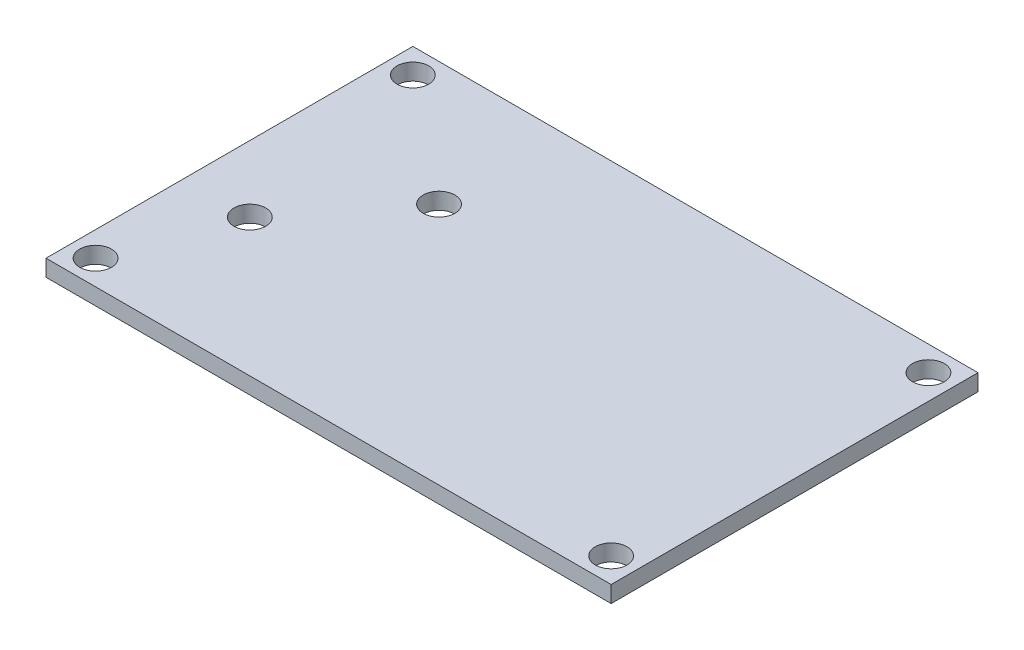
ISO-10303-21;
HEADER;
FILE_DESCRIPTION(('STEP AP214'),'2;1');
FILE_NAME('part.step','',(''),(''),'','','');
FILE_SCHEMA(('AUTOMOTIVE_DESIGN { 1 0 10303 214 1 1 1 1 }'));
ENDSEC;
DATA;
#1=APPLICATION_CONTEXT('core data for automotive mechanical design processes');
#2=APPLICATION_PROTOCOL_DEFINITION('international standard','automotive_design',2000,#1);
#3=PRODUCT_CONTEXT('',#1,'mechanical');
#4=PRODUCT('Part','Part','',(#3));
#5=PRODUCT_RELATED_PRODUCT_CATEGORY('part','',(#4));
#6=PRODUCT_DEFINITION_FORMATION('','',#4);
#7=PRODUCT_DEFINITION_CONTEXT('part definition',#1,'design');
#8=PRODUCT_DEFINITION('design','',#6,#7);
#9=PRODUCT_DEFINITION_SHAPE('','',#8);
#10=(LENGTH_UNIT() NAMED_UNIT(*) SI_UNIT(.MILLI.,.METRE.));
#11=(NAMED_UNIT(*) PLANE_ANGLE_UNIT() SI_UNIT($,.RADIAN.));
#12=(NAMED_UNIT(*) SI_UNIT($,.STERADIAN.) SOLID_ANGLE_UNIT());
#13=UNCERTAINTY_MEASURE_WITH_UNIT(LENGTH_MEASURE(1.E-05),#10,'distance_accuracy_value','');
#14=(GEOMETRIC_REPRESENTATION_CONTEXT(3) GLOBAL_UNCERTAINTY_ASSIGNED_CONTEXT((#13)) GLOBAL_UNIT_ASSIGNED_CONTEXT((#10,
#11,#12)) REPRESENTATION_CONTEXT('',''));
#15=CARTESIAN_POINT('',(0.,0.,0.));
#16=DIRECTION('',(0.,0.,1.));
#17=DIRECTION('',(1.,0.,0.));
#18=AXIS2_PLACEMENT_3D('',#15,#16,#17);
#19=CARTESIAN_POINT('',(-28.5,1.67,18.5));
#20=DIRECTION('',(1.,0.,0.));
#21=DIRECTION('',(0.,0.,-1.));
#22=AXIS2_PLACEMENT_3D('',#19,#20,#21);
#23=PLANE('',#22);
#24=DIRECTION('',(0.,0.,1.));
#25=VECTOR('',#24,1.);
#26=CARTESIAN_POINT('',(-28.5,0.,18.5));
#27=LINE('',#26,#25);
#28=CARTESIAN_POINT('',(-28.5,0.,-18.5));
#29=VERTEX_POINT('',#28);
#30=CARTESIAN_POINT('',(-28.5,0.,18.5));
#31=VERTEX_POINT('',#30);
#32=EDGE_CURVE('E95',#29,#31,#27,.T.);
#33=ORIENTED_EDGE('',*,*,#32,.T.);
#34=DIRECTION('',(0.,-1.,0.));
#35=VECTOR('',#34,1.);
#36=CARTESIAN_POINT('',(-28.5,1.67,18.5));
#37=LINE('',#36,#35);
#38=CARTESIAN_POINT('',(-28.5,1.67,18.5));
#39=VERTEX_POINT('',#38);
#40=EDGE_CURVE('E11',#39,#31,#37,.T.);
#41=ORIENTED_EDGE('',*,*,#40,.F.);
#42=DIRECTION('',(0.,0.,1.));
#43=VECTOR('',#42,1.);
#44=CARTESIAN_POINT('',(-28.5,1.67,18.5));
#45=LINE('',#44,#43);
#46=CARTESIAN_POINT('',(-28.5,1.67,-18.5));
#47=VERTEX_POINT('',#46);
#48=EDGE_CURVE('E83',#47,#39,#45,.T.);
#49=ORIENTED_EDGE('',*,*,#48,.F.);
#50=DIRECTION('',(0.,-1.,0.));
#51=VECTOR('',#50,1.);
#52=CARTESIAN_POINT('',(-28.5,1.67,-18.5));
#53=LINE('',#52,#51);
#54=EDGE_CURVE('E91',#47,#29,#53,.T.);
#55=ORIENTED_EDGE('',*,*,#54,.T.);
#56=EDGE_LOOP('',(#33,#41,#49,#55));
#57=FACE_BOUND('',#56,.T.);
#58=ADVANCED_FACE('F32',(#57),#23,.F.);
#59=CARTESIAN_POINT('',(28.5,1.67,18.5));
#60=DIRECTION('',(0.,0.,-1.));
#61=DIRECTION('',(-1.,0.,0.));
#62=AXIS2_PLACEMENT_3D('',#59,#60,#61);
#63=PLANE('',#62);
#64=DIRECTION('',(1.,0.,0.));
#65=VECTOR('',#64,1.);
#66=CARTESIAN_POINT('',(28.5,0.,18.5));
#67=LINE('',#66,#65);
#68=CARTESIAN_POINT('',(28.5,0.,18.5));
#69=VERTEX_POINT('',#68);
#70=EDGE_CURVE('E87',#31,#69,#67,.T.);
#71=ORIENTED_EDGE('',*,*,#70,.T.);
#72=DIRECTION('',(0.,-1.,0.));
#73=VECTOR('',#72,1.);
#74=CARTESIAN_POINT('',(28.5,1.67,18.5));
#75=LINE('',#74,#73);
#76=CARTESIAN_POINT('',(28.5,1.67,18.5));
#77=VERTEX_POINT('',#76);
#78=EDGE_CURVE('E40',#77,#69,#75,.T.);
#79=ORIENTED_EDGE('',*,*,#78,.F.);
#80=DIRECTION('',(1.,0.,0.));
#81=VECTOR('',#80,1.);
#82=CARTESIAN_POINT('',(28.5,1.67,18.5));
#83=LINE('',#82,#81);
#84=EDGE_CURVE('E78',#39,#77,#83,.T.);
#85=ORIENTED_EDGE('',*,*,#84,.F.);
#86=ORIENTED_EDGE('',*,*,#40,.T.);
#87=EDGE_LOOP('',(#71,#79,#85,#86));
#88=FACE_BOUND('',#87,.T.);
#89=ADVANCED_FACE('F86',(#88),#63,.F.);
#90=CARTESIAN_POINT('',(28.5,1.67,18.5));
#91=DIRECTION('',(-1.,0.,0.));
#92=DIRECTION('',(0.,0.,1.));
#93=AXIS2_PLACEMENT_3D('',#90,#91,#92);
#94=PLANE('',#93);
#95=DIRECTION('',(0.,0.,-1.));
#96=VECTOR('',#95,1.);
#97=CARTESIAN_POINT('',(28.5,0.,18.5));
#98=LINE('',#97,#96);
#99=CARTESIAN_POINT('',(28.5,0.,-18.5));
#100=VERTEX_POINT('',#99);
#101=EDGE_CURVE('E65',#69,#100,#98,.T.);
#102=ORIENTED_EDGE('',*,*,#101,.T.);
#103=DIRECTION('',(0.,-1.,0.));
#104=VECTOR('',#103,1.);
#105=CARTESIAN_POINT('',(28.5,1.67,-18.5));
#106=LINE('',#105,#104);
#107=CARTESIAN_POINT('',(28.5,1.67,-18.5));
#108=VERTEX_POINT('',#107);
#109=EDGE_CURVE('E88',#108,#100,#106,.T.);
#110=ORIENTED_EDGE('',*,*,#109,.F.);
#111=DIRECTION('',(0.,0.,-1.));
#112=VECTOR('',#111,1.);
#113=CARTESIAN_POINT('',(28.5,1.67,18.5));
#114=LINE('',#113,#112);
#115=EDGE_CURVE('E81',#77,#108,#114,.T.);
#116=ORIENTED_EDGE('',*,*,#115,.F.);
#117=ORIENTED_EDGE('',*,*,#78,.T.);
#118=EDGE_LOOP('',(#102,#110,#116,#117));
#119=FACE_BOUND('',#118,.T.);
#120=ADVANCED_FACE('F89',(#119),#94,.F.);
#121=CARTESIAN_POINT('',(28.5,1.67,-18.5));
#122=DIRECTION('',(0.,0.,1.));
#123=DIRECTION('',(1.,0.,0.));
#124=AXIS2_PLACEMENT_3D('',#121,#122,#123);
#125=PLANE('',#124);
#126=DIRECTION('',(-1.,0.,0.));
#127=VECTOR('',#126,1.);
#128=CARTESIAN_POINT('',(28.5,0.,-18.5));
#129=LINE('',#128,#127);
#130=EDGE_CURVE('E71',#100,#29,#129,.T.);
#131=ORIENTED_EDGE('',*,*,#130,.T.);
#132=ORIENTED_EDGE('',*,*,#54,.F.);
#133=DIRECTION('',(-1.,0.,0.));
#134=VECTOR('',#133,1.);
#135=CARTESIAN_POINT('',(28.5,1.67,-18.5));
#136=LINE('',#135,#134);
#137=EDGE_CURVE('E48',#108,#47,#136,.T.);
#138=ORIENTED_EDGE('',*,*,#137,.F.);
#139=ORIENTED_EDGE('',*,*,#109,.T.);
#140=EDGE_LOOP('',(#131,#132,#138,#139));
#141=FACE_BOUND('',#140,.T.);
#142=ADVANCED_FACE('F103',(#141),#125,.F.);
#143=CARTESIAN_POINT('',(0.,1.67,0.));
#144=DIRECTION('',(0.,1.,0.));
#145=DIRECTION('',(0.,0.,1.));
#146=AXIS2_PLACEMENT_3D('',#143,#144,#145);
#147=PLANE('',#146);
#148=CARTESIAN_POINT('',(-21.81,1.67,4.63000000000001));
#149=DIRECTION('',(0.,1.,0.));
#150=DIRECTION('',(0.,0.,1.));
#151=AXIS2_PLACEMENT_3D('',#148,#149,#150);
#152=CIRCLE('',#151,1.6);
#153=CARTESIAN_POINT('',(-21.81,1.67,6.23000000000001));
#154=VERTEX_POINT('',#153);
#155=EDGE_CURVE('E141',#154,#154,#152,.T.);
#156=ORIENTED_EDGE('',*,*,#155,.F.);
#157=EDGE_LOOP('',(#156));
#158=FACE_BOUND('',#157,.T.);
#159=CARTESIAN_POINT('',(-13.4,1.67,-6.03999999999999));
#160=DIRECTION('',(0.,1.,0.));
#161=DIRECTION('',(0.,0.,1.));
#162=AXIS2_PLACEMENT_3D('',#159,#160,#161);
#163=CIRCLE('',#162,1.6);
#164=CARTESIAN_POINT('',(-13.4,1.67,-4.43999999999999));
#165=VERTEX_POINT('',#164);
#166=EDGE_CURVE('E135',#165,#165,#163,.T.);
#167=ORIENTED_EDGE('',*,*,#166,.F.);
#168=EDGE_LOOP('',(#167));
#169=FACE_BOUND('',#168,.T.);
#170=CARTESIAN_POINT('',(26.,1.67,-16.));
#171=DIRECTION('',(0.,1.,0.));
#172=DIRECTION('',(0.,0.,1.));
#173=AXIS2_PLACEMENT_3D('',#170,#171,#172);
#174=CIRCLE('',#173,1.6);
#175=CARTESIAN_POINT('',(26.,1.67,-14.4));
#176=VERTEX_POINT('',#175);
#177=EDGE_CURVE('E129',#176,#176,#174,.T.);
#178=ORIENTED_EDGE('',*,*,#177,.F.);
#179=EDGE_LOOP('',(#178));
#180=FACE_BOUND('',#179,.T.);
#181=CARTESIAN_POINT('',(26.,1.67,16.));
#182=DIRECTION('',(0.,1.,0.));
#183=DIRECTION('',(0.,0.,1.));
#184=AXIS2_PLACEMENT_3D('',#181,#182,#183);
#185=CIRCLE('',#184,1.6);
#186=CARTESIAN_POINT('',(26.,1.67,17.6));
#187=VERTEX_POINT('',#186);
#188=EDGE_CURVE('E123',#187,#187,#185,.T.);
#189=ORIENTED_EDGE('',*,*,#188,.F.);
#190=EDGE_LOOP('',(#189));
#191=FACE_BOUND('',#190,.T.);
#192=CARTESIAN_POINT('',(-26.,1.67,-16.));
#193=DIRECTION('',(0.,1.,0.));
#194=DIRECTION('',(0.,0.,1.));
#195=AXIS2_PLACEMENT_3D('',#192,#193,#194);
#196=CIRCLE('',#195,1.6);
#197=CARTESIAN_POINT('',(-26.,1.67,-14.4));
#198=VERTEX_POINT('',#197);
#199=EDGE_CURVE('E117',#198,#198,#196,.T.);
#200=ORIENTED_EDGE('',*,*,#199,.F.);
#201=EDGE_LOOP('',(#200));
#202=FACE_BOUND('',#201,.T.);
#203=CARTESIAN_POINT('',(-26.,1.67,16.));
#204=DIRECTION('',(0.,1.,0.));
#205=DIRECTION('',(0.,0.,1.));
#206=AXIS2_PLACEMENT_3D('',#203,#204,#205);
#207=CIRCLE('',#206,1.6);
#208=CARTESIAN_POINT('',(-26.,1.67,17.6));
#209=VERTEX_POINT('',#208);
#210=EDGE_CURVE('E111',#209,#209,#207,.T.);
#211=ORIENTED_EDGE('',*,*,#210,.F.);
#212=EDGE_LOOP('',(#211));
#213=FACE_BOUND('',#212,.T.);
#214=ORIENTED_EDGE('',*,*,#48,.T.);
#215=ORIENTED_EDGE('',*,*,#84,.T.);
#216=ORIENTED_EDGE('',*,*,#115,.T.);
#217=ORIENTED_EDGE('',*,*,#137,.T.);
#218=EDGE_LOOP('',(#214,#215,#216,#217));
#219=FACE_BOUND('',#218,.T.);
#220=ADVANCED_FACE('F79',(#158,#169,#180,#191,#202,#213,#219),#147,.T.);
#221=CARTESIAN_POINT('',(0.,0.,0.));
#222=DIRECTION('',(0.,1.,0.));
#223=DIRECTION('',(0.,0.,1.));
#224=AXIS2_PLACEMENT_3D('',#221,#222,#223);
#225=PLANE('',#224);
#226=CARTESIAN_POINT('',(-21.81,0.,4.63000000000001));
#227=DIRECTION('',(0.,1.,0.));
#228=DIRECTION('',(0.,0.,1.));
#229=AXIS2_PLACEMENT_3D('',#226,#227,#228);
#230=CIRCLE('',#229,1.6);
#231=CARTESIAN_POINT('',(-21.81,0.,6.23000000000001));
#232=VERTEX_POINT('',#231);
#233=EDGE_CURVE('E138',#232,#232,#230,.F.);
#234=ORIENTED_EDGE('',*,*,#233,.F.);
#235=EDGE_LOOP('',(#234));
#236=FACE_BOUND('',#235,.T.);
#237=CARTESIAN_POINT('',(-13.4,0.,-6.03999999999999));
#238=DIRECTION('',(0.,1.,0.));
#239=DIRECTION('',(0.,0.,1.));
#240=AXIS2_PLACEMENT_3D('',#237,#238,#239);
#241=CIRCLE('',#240,1.6);
#242=CARTESIAN_POINT('',(-13.4,0.,-4.43999999999999));
#243=VERTEX_POINT('',#242);
#244=EDGE_CURVE('E132',#243,#243,#241,.F.);
#245=ORIENTED_EDGE('',*,*,#244,.F.);
#246=EDGE_LOOP('',(#245));
#247=FACE_BOUND('',#246,.T.);
#248=CARTESIAN_POINT('',(26.,0.,-16.));
#249=DIRECTION('',(0.,1.,0.));
#250=DIRECTION('',(0.,0.,1.));
#251=AXIS2_PLACEMENT_3D('',#248,#249,#250);
#252=CIRCLE('',#251,1.6);
#253=CARTESIAN_POINT('',(26.,0.,-14.4));
#254=VERTEX_POINT('',#253);
#255=EDGE_CURVE('E126',#254,#254,#252,.F.);
#256=ORIENTED_EDGE('',*,*,#255,.F.);
#257=EDGE_LOOP('',(#256));
#258=FACE_BOUND('',#257,.T.);
#259=CARTESIAN_POINT('',(26.,0.,16.));
#260=DIRECTION('',(0.,1.,0.));
#261=DIRECTION('',(0.,0.,1.));
#262=AXIS2_PLACEMENT_3D('',#259,#260,#261);
#263=CIRCLE('',#262,1.6);
#264=CARTESIAN_POINT('',(26.,0.,17.6));
#265=VERTEX_POINT('',#264);
#266=EDGE_CURVE('E120',#265,#265,#263,.F.);
#267=ORIENTED_EDGE('',*,*,#266,.F.);
#268=EDGE_LOOP('',(#267));
#269=FACE_BOUND('',#268,.T.);
#270=CARTESIAN_POINT('',(-26.,0.,-16.));
#271=DIRECTION('',(0.,1.,0.));
#272=DIRECTION('',(0.,0.,1.));
#273=AXIS2_PLACEMENT_3D('',#270,#271,#272);
#274=CIRCLE('',#273,1.6);
#275=CARTESIAN_POINT('',(-26.,0.,-14.4));
#276=VERTEX_POINT('',#275);
#277=EDGE_CURVE('E114',#276,#276,#274,.F.);
#278=ORIENTED_EDGE('',*,*,#277,.F.);
#279=EDGE_LOOP('',(#278));
#280=FACE_BOUND('',#279,.T.);
#281=CARTESIAN_POINT('',(-26.,0.,16.));
#282=DIRECTION('',(0.,1.,0.));
#283=DIRECTION('',(0.,0.,1.));
#284=AXIS2_PLACEMENT_3D('',#281,#282,#283);
#285=CIRCLE('',#284,1.6);
#286=CARTESIAN_POINT('',(-26.,0.,17.6));
#287=VERTEX_POINT('',#286);
#288=EDGE_CURVE('E98',#287,#287,#285,.F.);
#289=ORIENTED_EDGE('',*,*,#288,.F.);
#290=EDGE_LOOP('',(#289));
#291=FACE_BOUND('',#290,.T.);
#292=ORIENTED_EDGE('',*,*,#32,.F.);
#293=ORIENTED_EDGE('',*,*,#130,.F.);
#294=ORIENTED_EDGE('',*,*,#101,.F.);
#295=ORIENTED_EDGE('',*,*,#70,.F.);
#296=EDGE_LOOP('',(#292,#293,#294,#295));
#297=FACE_BOUND('',#296,.T.);
#298=ADVANCED_FACE('F106',(#236,#247,#258,#269,#280,#291,#297),#225,.F.);
#299=CARTESIAN_POINT('',(-26.,-4.52548339959391,16.));
#300=DIRECTION('',(0.,1.,0.));
#301=DIRECTION('',(0.,0.,1.));
#302=AXIS2_PLACEMENT_3D('',#299,#300,#301);
#303=CYLINDRICAL_SURFACE('',#302,1.6);
#304=ORIENTED_EDGE('',*,*,#288,.T.);
#305=EDGE_LOOP('',(#304));
#306=FACE_BOUND('',#305,.T.);
#307=ORIENTED_EDGE('',*,*,#210,.T.);
#308=EDGE_LOOP('',(#307));
#309=FACE_BOUND('',#308,.T.);
#310=ADVANCED_FACE('F160',(#306,#309),#303,.F.);
#311=CARTESIAN_POINT('',(-26.,-4.52548339959391,-16.));
#312=DIRECTION('',(0.,1.,0.));
#313=DIRECTION('',(0.,0.,1.));
#314=AXIS2_PLACEMENT_3D('',#311,#312,#313);
#315=CYLINDRICAL_SURFACE('',#314,1.6);
#316=ORIENTED_EDGE('',*,*,#277,.T.);
#317=EDGE_LOOP('',(#316));
#318=FACE_BOUND('',#317,.T.);
#319=ORIENTED_EDGE('',*,*,#199,.T.);
#320=EDGE_LOOP('',(#319));
#321=FACE_BOUND('',#320,.T.);
#322=ADVANCED_FACE('F162',(#318,#321),#315,.F.);
#323=CARTESIAN_POINT('',(26.,-4.52548339959391,16.));
#324=DIRECTION('',(0.,1.,0.));
#325=DIRECTION('',(0.,0.,1.));
#326=AXIS2_PLACEMENT_3D('',#323,#324,#325);
#327=CYLINDRICAL_SURFACE('',#326,1.6);
#328=ORIENTED_EDGE('',*,*,#266,.T.);
#329=EDGE_LOOP('',(#328));
#330=FACE_BOUND('',#329,.T.);
#331=ORIENTED_EDGE('',*,*,#188,.T.);
#332=EDGE_LOOP('',(#331));
#333=FACE_BOUND('',#332,.T.);
#334=ADVANCED_FACE('F169',(#330,#333),#327,.F.);
#335=CARTESIAN_POINT('',(26.,-4.52548339959391,-16.));
#336=DIRECTION('',(0.,1.,0.));
#337=DIRECTION('',(0.,0.,1.));
#338=AXIS2_PLACEMENT_3D('',#335,#336,#337);
#339=CYLINDRICAL_SURFACE('',#338,1.6);
#340=ORIENTED_EDGE('',*,*,#255,.T.);
#341=EDGE_LOOP('',(#340));
#342=FACE_BOUND('',#341,.T.);
#343=ORIENTED_EDGE('',*,*,#177,.T.);
#344=EDGE_LOOP('',(#343));
#345=FACE_BOUND('',#344,.T.);
#346=ADVANCED_FACE('F215',(#342,#345),#339,.F.);
#347=CARTESIAN_POINT('',(-13.4,-4.52548339959391,-6.03999999999999));
#348=DIRECTION('',(0.,1.,0.));
#349=DIRECTION('',(0.,0.,1.));
#350=AXIS2_PLACEMENT_3D('',#347,#348,#349);
#351=CYLINDRICAL_SURFACE('',#350,1.6);
#352=ORIENTED_EDGE('',*,*,#244,.T.);
#353=EDGE_LOOP('',(#352));
#354=FACE_BOUND('',#353,.T.);
#355=ORIENTED_EDGE('',*,*,#166,.T.);
#356=EDGE_LOOP('',(#355));
#357=FACE_BOUND('',#356,.T.);
#358=ADVANCED_FACE('F225',(#354,#357),#351,.F.);
#359=CARTESIAN_POINT('',(-21.81,-4.52548339959391,4.63000000000001));
#360=DIRECTION('',(0.,1.,0.));
#361=DIRECTION('',(0.,0.,1.));
#362=AXIS2_PLACEMENT_3D('',#359,#360,#361);
#363=CYLINDRICAL_SURFACE('',#362,1.6);
#364=ORIENTED_EDGE('',*,*,#233,.T.);
#365=EDGE_LOOP('',(#364));
#366=FACE_BOUND('',#365,.T.);
#367=ORIENTED_EDGE('',*,*,#155,.T.);
#368=EDGE_LOOP('',(#367));
#369=FACE_BOUND('',#368,.T.);
#370=ADVANCED_FACE('F145',(#366,#369),#363,.F.);
#371=CLOSED_SHELL('',(#58,#89,#120,#142,#220,#298,#310,#322,#334,#346,#358,#370));
#372=MANIFOLD_SOLID_BREP('B2',#371);
#373=ADVANCED_BREP_SHAPE_REPRESENTATION('',(#18,#372),#14);
#374=SHAPE_DEFINITION_REPRESENTATION(#9,#373);
ENDSEC;
END-ISO-10303-21;
